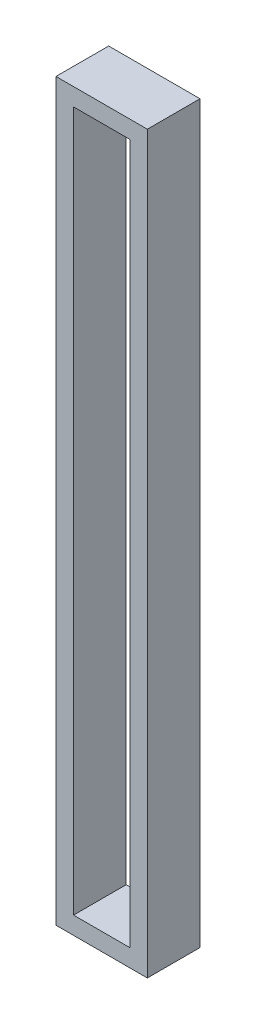
ISO-10303-21;
HEADER;
FILE_DESCRIPTION(('STEP AP214'),'2;1');
FILE_NAME('part.step','',(''),(''),'','','');
FILE_SCHEMA(('AUTOMOTIVE_DESIGN { 1 0 10303 214 1 1 1 1 }'));
ENDSEC;
DATA;
#1=APPLICATION_CONTEXT('core data for automotive mechanical design processes');
#2=APPLICATION_PROTOCOL_DEFINITION('international standard','automotive_design',2000,#1);
#3=PRODUCT_CONTEXT('',#1,'mechanical');
#4=PRODUCT('Part','Part','',(#3));
#5=PRODUCT_RELATED_PRODUCT_CATEGORY('part','',(#4));
#6=PRODUCT_DEFINITION_FORMATION('','',#4);
#7=PRODUCT_DEFINITION_CONTEXT('part definition',#1,'design');
#8=PRODUCT_DEFINITION('design','',#6,#7);
#9=PRODUCT_DEFINITION_SHAPE('','',#8);
#10=(LENGTH_UNIT() NAMED_UNIT(*) SI_UNIT(.MILLI.,.METRE.));
#11=(NAMED_UNIT(*) PLANE_ANGLE_UNIT() SI_UNIT($,.RADIAN.));
#12=(NAMED_UNIT(*) SI_UNIT($,.STERADIAN.) SOLID_ANGLE_UNIT());
#13=UNCERTAINTY_MEASURE_WITH_UNIT(LENGTH_MEASURE(1.E-05),#10,'distance_accuracy_value','');
#14=(GEOMETRIC_REPRESENTATION_CONTEXT(3) GLOBAL_UNCERTAINTY_ASSIGNED_CONTEXT((#13)) GLOBAL_UNIT_ASSIGNED_CONTEXT((#10,
#11,#12)) REPRESENTATION_CONTEXT('',''));
#15=CARTESIAN_POINT('',(0.,0.,0.));
#16=DIRECTION('',(0.,0.,1.));
#17=DIRECTION('',(1.,0.,0.));
#18=AXIS2_PLACEMENT_3D('',#15,#16,#17);
#19=CARTESIAN_POINT('',(0.,0.,3.));
#20=DIRECTION('',(0.,0.,1.));
#21=DIRECTION('',(1.,0.,0.));
#22=AXIS2_PLACEMENT_3D('',#19,#20,#21);
#23=PLANE('',#22);
#24=DIRECTION('',(1.,0.,0.));
#25=VECTOR('',#24,1.);
#26=CARTESIAN_POINT('',(-4.2,-1.,3.));
#27=LINE('',#26,#25);
#28=CARTESIAN_POINT('',(-4.2,-1.,3.));
#29=VERTEX_POINT('',#28);
#30=CARTESIAN_POINT('',(1.,-0.999999999999999,3.));
#31=VERTEX_POINT('',#30);
#32=EDGE_CURVE('E137',#29,#31,#27,.T.);
#33=ORIENTED_EDGE('',*,*,#32,.T.);
#34=DIRECTION('',(0.,1.,0.));
#35=VECTOR('',#34,1.);
#36=CARTESIAN_POINT('',(1.,-0.999999999999999,3.));
#37=LINE('',#36,#35);
#38=CARTESIAN_POINT('',(0.999999999999993,40.84,3.));
#39=VERTEX_POINT('',#38);
#40=EDGE_CURVE('E143',#31,#39,#37,.T.);
#41=ORIENTED_EDGE('',*,*,#40,.T.);
#42=DIRECTION('',(-1.,0.,0.));
#43=VECTOR('',#42,1.);
#44=CARTESIAN_POINT('',(-4.2,40.84,3.));
#45=LINE('',#44,#43);
#46=CARTESIAN_POINT('',(-4.2,40.84,3.));
#47=VERTEX_POINT('',#46);
#48=EDGE_CURVE('E146',#39,#47,#45,.T.);
#49=ORIENTED_EDGE('',*,*,#48,.T.);
#50=DIRECTION('',(0.,-1.,0.));
#51=VECTOR('',#50,1.);
#52=CARTESIAN_POINT('',(-4.2,-1.,3.));
#53=LINE('',#52,#51);
#54=EDGE_CURVE('E148',#47,#29,#53,.T.);
#55=ORIENTED_EDGE('',*,*,#54,.T.);
#56=EDGE_LOOP('',(#33,#41,#49,#55));
#57=FACE_BOUND('',#56,.T.);
#58=DIRECTION('',(0.,1.,0.));
#59=VECTOR('',#58,1.);
#60=CARTESIAN_POINT('',(0.,0.,3.));
#61=LINE('',#60,#59);
#62=CARTESIAN_POINT('',(0.,0.,3.));
#63=VERTEX_POINT('',#62);
#64=CARTESIAN_POINT('',(0.,39.84,3.));
#65=VERTEX_POINT('',#64);
#66=EDGE_CURVE('E115',#63,#65,#61,.T.);
#67=ORIENTED_EDGE('',*,*,#66,.F.);
#68=DIRECTION('',(1.,0.,0.));
#69=VECTOR('',#68,1.);
#70=CARTESIAN_POINT('',(0.,0.,3.));
#71=LINE('',#70,#69);
#72=CARTESIAN_POINT('',(-3.2,0.,3.));
#73=VERTEX_POINT('',#72);
#74=EDGE_CURVE('E103',#73,#63,#71,.T.);
#75=ORIENTED_EDGE('',*,*,#74,.F.);
#76=DIRECTION('',(0.,-1.,0.));
#77=VECTOR('',#76,1.);
#78=CARTESIAN_POINT('',(-3.2,0.,3.));
#79=LINE('',#78,#77);
#80=CARTESIAN_POINT('',(-3.2,39.84,3.));
#81=VERTEX_POINT('',#80);
#82=EDGE_CURVE('E127',#81,#73,#79,.T.);
#83=ORIENTED_EDGE('',*,*,#82,.F.);
#84=DIRECTION('',(-1.,0.,0.));
#85=VECTOR('',#84,1.);
#86=CARTESIAN_POINT('',(0.,39.84,3.));
#87=LINE('',#86,#85);
#88=EDGE_CURVE('E124',#65,#81,#87,.T.);
#89=ORIENTED_EDGE('',*,*,#88,.F.);
#90=EDGE_LOOP('',(#67,#75,#83,#89));
#91=FACE_BOUND('',#90,.T.);
#92=ADVANCED_FACE('F39',(#57,#91),#23,.T.);
#93=CARTESIAN_POINT('',(0.,0.,0.));
#94=DIRECTION('',(0.,0.,1.));
#95=DIRECTION('',(1.,0.,0.));
#96=AXIS2_PLACEMENT_3D('',#93,#94,#95);
#97=PLANE('',#96);
#98=DIRECTION('',(1.,0.,0.));
#99=VECTOR('',#98,1.);
#100=CARTESIAN_POINT('',(-4.2,-1.,0.));
#101=LINE('',#100,#99);
#102=CARTESIAN_POINT('',(-4.2,-1.,0.));
#103=VERTEX_POINT('',#102);
#104=CARTESIAN_POINT('',(1.,-0.999999999999999,0.));
#105=VERTEX_POINT('',#104);
#106=EDGE_CURVE('E119',#103,#105,#101,.T.);
#107=ORIENTED_EDGE('',*,*,#106,.F.);
#108=DIRECTION('',(0.,-1.,0.));
#109=VECTOR('',#108,1.);
#110=CARTESIAN_POINT('',(-4.2,-1.,0.));
#111=LINE('',#110,#109);
#112=CARTESIAN_POINT('',(-4.2,40.84,0.));
#113=VERTEX_POINT('',#112);
#114=EDGE_CURVE('E142',#113,#103,#111,.T.);
#115=ORIENTED_EDGE('',*,*,#114,.F.);
#116=DIRECTION('',(-1.,0.,0.));
#117=VECTOR('',#116,1.);
#118=CARTESIAN_POINT('',(-4.2,40.84,0.));
#119=LINE('',#118,#117);
#120=CARTESIAN_POINT('',(0.999999999999993,40.84,0.));
#121=VERTEX_POINT('',#120);
#122=EDGE_CURVE('E154',#121,#113,#119,.T.);
#123=ORIENTED_EDGE('',*,*,#122,.F.);
#124=DIRECTION('',(0.,1.,0.));
#125=VECTOR('',#124,1.);
#126=CARTESIAN_POINT('',(1.,-0.999999999999999,0.));
#127=LINE('',#126,#125);
#128=EDGE_CURVE('E152',#105,#121,#127,.T.);
#129=ORIENTED_EDGE('',*,*,#128,.F.);
#130=EDGE_LOOP('',(#107,#115,#123,#129));
#131=FACE_BOUND('',#130,.T.);
#132=DIRECTION('',(1.,0.,0.));
#133=VECTOR('',#132,1.);
#134=CARTESIAN_POINT('',(0.,0.,0.));
#135=LINE('',#134,#133);
#136=CARTESIAN_POINT('',(-3.2,0.,0.));
#137=VERTEX_POINT('',#136);
#138=CARTESIAN_POINT('',(0.,0.,0.));
#139=VERTEX_POINT('',#138);
#140=EDGE_CURVE('E65',#137,#139,#135,.T.);
#141=ORIENTED_EDGE('',*,*,#140,.T.);
#142=DIRECTION('',(0.,1.,0.));
#143=VECTOR('',#142,1.);
#144=CARTESIAN_POINT('',(0.,0.,0.));
#145=LINE('',#144,#143);
#146=CARTESIAN_POINT('',(0.,39.84,0.));
#147=VERTEX_POINT('',#146);
#148=EDGE_CURVE('E117',#139,#147,#145,.T.);
#149=ORIENTED_EDGE('',*,*,#148,.T.);
#150=DIRECTION('',(-1.,0.,0.));
#151=VECTOR('',#150,1.);
#152=CARTESIAN_POINT('',(0.,39.84,0.));
#153=LINE('',#152,#151);
#154=CARTESIAN_POINT('',(-3.2,39.84,0.));
#155=VERTEX_POINT('',#154);
#156=EDGE_CURVE('E132',#147,#155,#153,.T.);
#157=ORIENTED_EDGE('',*,*,#156,.T.);
#158=DIRECTION('',(0.,-1.,0.));
#159=VECTOR('',#158,1.);
#160=CARTESIAN_POINT('',(-3.2,0.,0.));
#161=LINE('',#160,#159);
#162=EDGE_CURVE('E114',#155,#137,#161,.T.);
#163=ORIENTED_EDGE('',*,*,#162,.T.);
#164=EDGE_LOOP('',(#141,#149,#157,#163));
#165=FACE_BOUND('',#164,.T.);
#166=ADVANCED_FACE('F171',(#131,#165),#97,.F.);
#167=CARTESIAN_POINT('',(-4.2,-1.,3.));
#168=DIRECTION('',(0.,1.,0.));
#169=DIRECTION('',(-1.,0.,0.));
#170=AXIS2_PLACEMENT_3D('',#167,#168,#169);
#171=PLANE('',#170);
#172=ORIENTED_EDGE('',*,*,#106,.T.);
#173=DIRECTION('',(0.,0.,-1.));
#174=VECTOR('',#173,1.);
#175=CARTESIAN_POINT('',(1.,-0.999999999999999,3.));
#176=LINE('',#175,#174);
#177=EDGE_CURVE('E11',#31,#105,#176,.T.);
#178=ORIENTED_EDGE('',*,*,#177,.F.);
#179=ORIENTED_EDGE('',*,*,#32,.F.);
#180=DIRECTION('',(0.,0.,-1.));
#181=VECTOR('',#180,1.);
#182=CARTESIAN_POINT('',(-4.2,-1.,3.));
#183=LINE('',#182,#181);
#184=EDGE_CURVE('E149',#29,#103,#183,.T.);
#185=ORIENTED_EDGE('',*,*,#184,.T.);
#186=EDGE_LOOP('',(#172,#178,#179,#185));
#187=FACE_BOUND('',#186,.T.);
#188=ADVANCED_FACE('F41',(#187),#171,.F.);
#189=CARTESIAN_POINT('',(1.,-0.999999999999999,3.));
#190=DIRECTION('',(-1.,0.,0.));
#191=DIRECTION('',(0.,-1.,0.));
#192=AXIS2_PLACEMENT_3D('',#189,#190,#191);
#193=PLANE('',#192);
#194=ORIENTED_EDGE('',*,*,#128,.T.);
#195=DIRECTION('',(0.,0.,-1.));
#196=VECTOR('',#195,1.);
#197=CARTESIAN_POINT('',(0.999999999999993,40.84,3.));
#198=LINE('',#197,#196);
#199=EDGE_CURVE('E50',#39,#121,#198,.T.);
#200=ORIENTED_EDGE('',*,*,#199,.F.);
#201=ORIENTED_EDGE('',*,*,#40,.F.);
#202=ORIENTED_EDGE('',*,*,#177,.T.);
#203=EDGE_LOOP('',(#194,#200,#201,#202));
#204=FACE_BOUND('',#203,.T.);
#205=ADVANCED_FACE('F181',(#204),#193,.F.);
#206=CARTESIAN_POINT('',(-4.2,40.84,3.));
#207=DIRECTION('',(0.,-1.,0.));
#208=DIRECTION('',(0.,0.,-1.));
#209=AXIS2_PLACEMENT_3D('',#206,#207,#208);
#210=PLANE('',#209);
#211=ORIENTED_EDGE('',*,*,#122,.T.);
#212=DIRECTION('',(0.,0.,-1.));
#213=VECTOR('',#212,1.);
#214=CARTESIAN_POINT('',(-4.2,40.84,3.));
#215=LINE('',#214,#213);
#216=EDGE_CURVE('E158',#47,#113,#215,.T.);
#217=ORIENTED_EDGE('',*,*,#216,.F.);
#218=ORIENTED_EDGE('',*,*,#48,.F.);
#219=ORIENTED_EDGE('',*,*,#199,.T.);
#220=EDGE_LOOP('',(#211,#217,#218,#219));
#221=FACE_BOUND('',#220,.T.);
#222=ADVANCED_FACE('F170',(#221),#210,.F.);
#223=CARTESIAN_POINT('',(-4.2,-1.,3.));
#224=DIRECTION('',(1.,0.,0.));
#225=DIRECTION('',(0.,0.,-1.));
#226=AXIS2_PLACEMENT_3D('',#223,#224,#225);
#227=PLANE('',#226);
#228=ORIENTED_EDGE('',*,*,#114,.T.);
#229=ORIENTED_EDGE('',*,*,#184,.F.);
#230=ORIENTED_EDGE('',*,*,#54,.F.);
#231=ORIENTED_EDGE('',*,*,#216,.T.);
#232=EDGE_LOOP('',(#228,#229,#230,#231));
#233=FACE_BOUND('',#232,.T.);
#234=ADVANCED_FACE('F180',(#233),#227,.F.);
#235=CARTESIAN_POINT('',(0.,0.,3.));
#236=DIRECTION('',(0.,1.,0.));
#237=DIRECTION('',(0.,0.,1.));
#238=AXIS2_PLACEMENT_3D('',#235,#236,#237);
#239=PLANE('',#238);
#240=ORIENTED_EDGE('',*,*,#140,.F.);
#241=DIRECTION('',(0.,0.,-1.));
#242=VECTOR('',#241,1.);
#243=CARTESIAN_POINT('',(-3.2,0.,3.));
#244=LINE('',#243,#242);
#245=EDGE_CURVE('E109',#73,#137,#244,.T.);
#246=ORIENTED_EDGE('',*,*,#245,.F.);
#247=ORIENTED_EDGE('',*,*,#74,.T.);
#248=DIRECTION('',(0.,0.,-1.));
#249=VECTOR('',#248,1.);
#250=CARTESIAN_POINT('',(0.,0.,3.));
#251=LINE('',#250,#249);
#252=EDGE_CURVE('E110',#63,#139,#251,.T.);
#253=ORIENTED_EDGE('',*,*,#252,.T.);
#254=EDGE_LOOP('',(#240,#246,#247,#253));
#255=FACE_BOUND('',#254,.T.);
#256=ADVANCED_FACE('F107',(#255),#239,.T.);
#257=CARTESIAN_POINT('',(0.,0.,3.));
#258=DIRECTION('',(-1.,0.,0.));
#259=DIRECTION('',(0.,0.,1.));
#260=AXIS2_PLACEMENT_3D('',#257,#258,#259);
#261=PLANE('',#260);
#262=ORIENTED_EDGE('',*,*,#148,.F.);
#263=ORIENTED_EDGE('',*,*,#252,.F.);
#264=ORIENTED_EDGE('',*,*,#66,.T.);
#265=DIRECTION('',(0.,0.,-1.));
#266=VECTOR('',#265,1.);
#267=CARTESIAN_POINT('',(0.,39.84,3.));
#268=LINE('',#267,#266);
#269=EDGE_CURVE('E122',#65,#147,#268,.T.);
#270=ORIENTED_EDGE('',*,*,#269,.T.);
#271=EDGE_LOOP('',(#262,#263,#264,#270));
#272=FACE_BOUND('',#271,.T.);
#273=ADVANCED_FACE('F116',(#272),#261,.T.);
#274=CARTESIAN_POINT('',(0.,39.84,3.));
#275=DIRECTION('',(0.,-1.,0.));
#276=DIRECTION('',(0.,0.,-1.));
#277=AXIS2_PLACEMENT_3D('',#274,#275,#276);
#278=PLANE('',#277);
#279=ORIENTED_EDGE('',*,*,#156,.F.);
#280=ORIENTED_EDGE('',*,*,#269,.F.);
#281=ORIENTED_EDGE('',*,*,#88,.T.);
#282=DIRECTION('',(0.,0.,-1.));
#283=VECTOR('',#282,1.);
#284=CARTESIAN_POINT('',(-3.2,39.84,3.));
#285=LINE('',#284,#283);
#286=EDGE_CURVE('E53',#81,#155,#285,.T.);
#287=ORIENTED_EDGE('',*,*,#286,.T.);
#288=EDGE_LOOP('',(#279,#280,#281,#287));
#289=FACE_BOUND('',#288,.T.);
#290=ADVANCED_FACE('F207',(#289),#278,.T.);
#291=CARTESIAN_POINT('',(-3.2,0.,3.));
#292=DIRECTION('',(1.,0.,0.));
#293=DIRECTION('',(0.,0.,-1.));
#294=AXIS2_PLACEMENT_3D('',#291,#292,#293);
#295=PLANE('',#294);
#296=ORIENTED_EDGE('',*,*,#162,.F.);
#297=ORIENTED_EDGE('',*,*,#286,.F.);
#298=ORIENTED_EDGE('',*,*,#82,.T.);
#299=ORIENTED_EDGE('',*,*,#245,.T.);
#300=EDGE_LOOP('',(#296,#297,#298,#299));
#301=FACE_BOUND('',#300,.T.);
#302=ADVANCED_FACE('F208',(#301),#295,.T.);
#303=CLOSED_SHELL('',(#92,#166,#188,#205,#222,#234,#256,#273,#290,#302));
#304=MANIFOLD_SOLID_BREP('B2',#303);
#305=ADVANCED_BREP_SHAPE_REPRESENTATION('',(#18,#304),#14);
#306=SHAPE_DEFINITION_REPRESENTATION(#9,#305);
ENDSEC;
END-ISO-10303-21;
